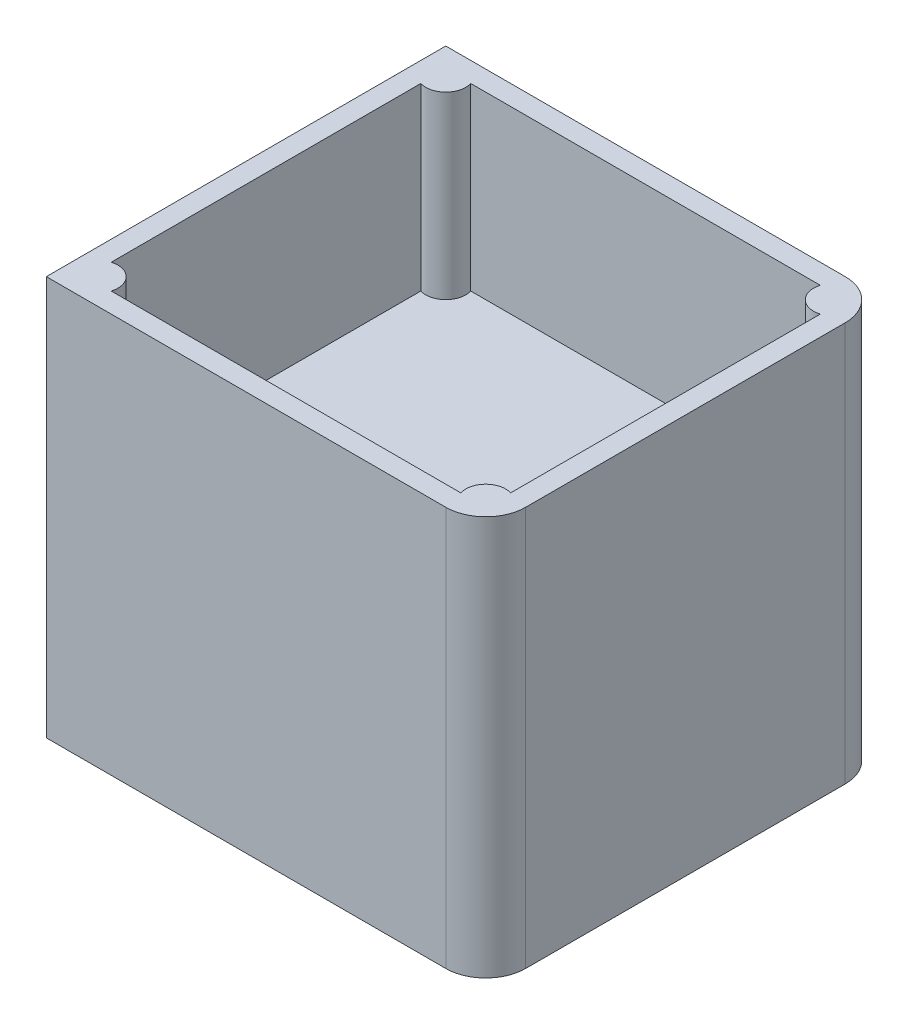
ISO-10303-21;
HEADER;
FILE_DESCRIPTION(('STEP AP214'),'2;1');
FILE_NAME('part.step','',(''),(''),'','','');
FILE_SCHEMA(('AUTOMOTIVE_DESIGN { 1 0 10303 214 1 1 1 1 }'));
ENDSEC;
DATA;
#1=APPLICATION_CONTEXT('core data for automotive mechanical design processes');
#2=APPLICATION_PROTOCOL_DEFINITION('international standard','automotive_design',2000,#1);
#3=PRODUCT_CONTEXT('',#1,'mechanical');
#4=PRODUCT('Part','Part','',(#3));
#5=PRODUCT_RELATED_PRODUCT_CATEGORY('part','',(#4));
#6=PRODUCT_DEFINITION_FORMATION('','',#4);
#7=PRODUCT_DEFINITION_CONTEXT('part definition',#1,'design');
#8=PRODUCT_DEFINITION('design','',#6,#7);
#9=PRODUCT_DEFINITION_SHAPE('','',#8);
#10=(LENGTH_UNIT() NAMED_UNIT(*) SI_UNIT(.MILLI.,.METRE.));
#11=(NAMED_UNIT(*) PLANE_ANGLE_UNIT() SI_UNIT($,.RADIAN.));
#12=(NAMED_UNIT(*) SI_UNIT($,.STERADIAN.) SOLID_ANGLE_UNIT());
#13=UNCERTAINTY_MEASURE_WITH_UNIT(LENGTH_MEASURE(1.E-05),#10,'distance_accuracy_value','');
#14=(GEOMETRIC_REPRESENTATION_CONTEXT(3) GLOBAL_UNCERTAINTY_ASSIGNED_CONTEXT((#13)) GLOBAL_UNIT_ASSIGNED_CONTEXT((#10,
#11,#12)) REPRESENTATION_CONTEXT('',''));
#15=CARTESIAN_POINT('',(0.,0.,0.));
#16=DIRECTION('',(0.,0.,1.));
#17=DIRECTION('',(1.,0.,0.));
#18=AXIS2_PLACEMENT_3D('',#15,#16,#17);
#19=CARTESIAN_POINT('',(-55.,100.,50.));
#20=DIRECTION('',(1.,0.,0.));
#21=DIRECTION('',(0.,0.,-1.));
#22=AXIS2_PLACEMENT_3D('',#19,#20,#21);
#23=PLANE('',#22);
#24=DIRECTION('',(0.,0.,1.));
#25=VECTOR('',#24,1.);
#26=CARTESIAN_POINT('',(-55.,0.,50.));
#27=LINE('',#26,#25);
#28=CARTESIAN_POINT('',(-55.,0.,-50.));
#29=VERTEX_POINT('',#28);
#30=CARTESIAN_POINT('',(-55.,0.,-3.75));
#31=VERTEX_POINT('',#30);
#32=EDGE_CURVE('E223',#29,#31,#27,.T.);
#33=ORIENTED_EDGE('',*,*,#32,.T.);
#34=DIRECTION('',(0.,-1.,0.));
#35=VECTOR('',#34,1.);
#36=CARTESIAN_POINT('',(-55.,0.,-3.75));
#37=LINE('',#36,#35);
#38=CARTESIAN_POINT('',(-55.,5.,-3.75));
#39=VERTEX_POINT('',#38);
#40=EDGE_CURVE('E204',#39,#31,#37,.T.);
#41=ORIENTED_EDGE('',*,*,#40,.F.);
#42=DIRECTION('',(0.,0.,-1.));
#43=VECTOR('',#42,1.);
#44=CARTESIAN_POINT('',(-55.,5.,-3.75));
#45=LINE('',#44,#43);
#46=CARTESIAN_POINT('',(-55.,5.,3.75));
#47=VERTEX_POINT('',#46);
#48=EDGE_CURVE('E228',#47,#39,#45,.T.);
#49=ORIENTED_EDGE('',*,*,#48,.F.);
#50=DIRECTION('',(0.,1.,0.));
#51=VECTOR('',#50,1.);
#52=CARTESIAN_POINT('',(-55.,0.,3.75));
#53=LINE('',#52,#51);
#54=CARTESIAN_POINT('',(-55.,0.,3.75));
#55=VERTEX_POINT('',#54);
#56=EDGE_CURVE('E216',#55,#47,#53,.T.);
#57=ORIENTED_EDGE('',*,*,#56,.F.);
#58=CARTESIAN_POINT('',(-55.,0.,50.));
#59=VERTEX_POINT('',#58);
#60=EDGE_CURVE('E236',#55,#59,#27,.T.);
#61=ORIENTED_EDGE('',*,*,#60,.T.);
#62=DIRECTION('',(0.,-1.,0.));
#63=VECTOR('',#62,1.);
#64=CARTESIAN_POINT('',(-55.,100.,50.));
#65=LINE('',#64,#63);
#66=CARTESIAN_POINT('',(-55.,100.,50.));
#67=VERTEX_POINT('',#66);
#68=EDGE_CURVE('E277',#67,#59,#65,.T.);
#69=ORIENTED_EDGE('',*,*,#68,.F.);
#70=DIRECTION('',(0.,0.,1.));
#71=VECTOR('',#70,1.);
#72=CARTESIAN_POINT('',(-55.,100.,50.));
#73=LINE('',#72,#71);
#74=CARTESIAN_POINT('',(-55.,100.,-50.));
#75=VERTEX_POINT('',#74);
#76=EDGE_CURVE('E258',#75,#67,#73,.T.);
#77=ORIENTED_EDGE('',*,*,#76,.F.);
#78=DIRECTION('',(0.,-1.,0.));
#79=VECTOR('',#78,1.);
#80=CARTESIAN_POINT('',(-55.,100.,-50.));
#81=LINE('',#80,#79);
#82=EDGE_CURVE('E233',#75,#29,#81,.T.);
#83=ORIENTED_EDGE('',*,*,#82,.T.);
#84=EDGE_LOOP('',(#33,#41,#49,#57,#61,#69,#77,#83));
#85=FACE_BOUND('',#84,.T.);
#86=ADVANCED_FACE('F45',(#85),#23,.F.);
#87=CARTESIAN_POINT('',(-55.,100.,50.));
#88=DIRECTION('',(0.,0.,-1.));
#89=DIRECTION('',(-1.,0.,0.));
#90=AXIS2_PLACEMENT_3D('',#87,#88,#89);
#91=PLANE('',#90);
#92=DIRECTION('',(1.,0.,0.));
#93=VECTOR('',#92,1.);
#94=CARTESIAN_POINT('',(-55.,0.,50.));
#95=LINE('',#94,#93);
#96=CARTESIAN_POINT('',(45.,0.,50.));
#97=VERTEX_POINT('',#96);
#98=EDGE_CURVE('E235',#59,#97,#95,.T.);
#99=ORIENTED_EDGE('',*,*,#98,.T.);
#100=DIRECTION('',(0.,-1.,0.));
#101=VECTOR('',#100,1.);
#102=CARTESIAN_POINT('',(45.,100.,50.));
#103=LINE('',#102,#101);
#104=CARTESIAN_POINT('',(45.,100.,50.));
#105=VERTEX_POINT('',#104);
#106=EDGE_CURVE('E273',#105,#97,#103,.T.);
#107=ORIENTED_EDGE('',*,*,#106,.F.);
#108=DIRECTION('',(1.,0.,0.));
#109=VECTOR('',#108,1.);
#110=CARTESIAN_POINT('',(-55.,100.,50.));
#111=LINE('',#110,#109);
#112=EDGE_CURVE('E408',#67,#105,#111,.T.);
#113=ORIENTED_EDGE('',*,*,#112,.F.);
#114=ORIENTED_EDGE('',*,*,#68,.T.);
#115=EDGE_LOOP('',(#99,#107,#113,#114));
#116=FACE_BOUND('',#115,.T.);
#117=ADVANCED_FACE('F429',(#116),#91,.F.);
#118=CARTESIAN_POINT('',(45.,100.,40.));
#119=DIRECTION('',(0.,-1.,0.));
#120=DIRECTION('',(0.,0.,-1.));
#121=AXIS2_PLACEMENT_3D('',#118,#119,#120);
#122=CYLINDRICAL_SURFACE('',#121,10.);
#123=DIRECTION('',(0.,-1.,0.));
#124=VECTOR('',#123,1.);
#125=CARTESIAN_POINT('',(55.,100.,40.));
#126=LINE('',#125,#124);
#127=CARTESIAN_POINT('',(55.,100.,40.));
#128=VERTEX_POINT('',#127);
#129=CARTESIAN_POINT('',(55.,0.,40.));
#130=VERTEX_POINT('',#129);
#131=EDGE_CURVE('E269',#128,#130,#126,.T.);
#132=ORIENTED_EDGE('',*,*,#131,.F.);
#133=CARTESIAN_POINT('',(45.,100.,40.));
#134=DIRECTION('',(0.,1.,0.));
#135=DIRECTION('',(0.,0.,1.));
#136=AXIS2_PLACEMENT_3D('',#133,#134,#135);
#137=CIRCLE('',#136,10.);
#138=EDGE_CURVE('E411',#105,#128,#137,.T.);
#139=ORIENTED_EDGE('',*,*,#138,.F.);
#140=ORIENTED_EDGE('',*,*,#106,.T.);
#141=CARTESIAN_POINT('',(45.,0.,40.));
#142=DIRECTION('',(0.,1.,0.));
#143=DIRECTION('',(0.,0.,1.));
#144=AXIS2_PLACEMENT_3D('',#141,#142,#143);
#145=CIRCLE('',#144,10.);
#146=EDGE_CURVE('E240',#97,#130,#145,.T.);
#147=ORIENTED_EDGE('',*,*,#146,.T.);
#148=EDGE_LOOP('',(#132,#139,#140,#147));
#149=FACE_BOUND('',#148,.T.);
#150=ADVANCED_FACE('F436',(#149),#122,.T.);
#151=CARTESIAN_POINT('',(55.,100.,40.));
#152=DIRECTION('',(-1.,0.,0.));
#153=DIRECTION('',(0.,0.,1.));
#154=AXIS2_PLACEMENT_3D('',#151,#152,#153);
#155=PLANE('',#154);
#156=DIRECTION('',(0.,0.,-1.));
#157=VECTOR('',#156,1.);
#158=CARTESIAN_POINT('',(55.,0.,40.));
#159=LINE('',#158,#157);
#160=CARTESIAN_POINT('',(55.,0.,-40.));
#161=VERTEX_POINT('',#160);
#162=EDGE_CURVE('E249',#130,#161,#159,.T.);
#163=ORIENTED_EDGE('',*,*,#162,.T.);
#164=DIRECTION('',(0.,-1.,0.));
#165=VECTOR('',#164,1.);
#166=CARTESIAN_POINT('',(55.,100.,-40.));
#167=LINE('',#166,#165);
#168=CARTESIAN_POINT('',(55.,100.,-40.));
#169=VERTEX_POINT('',#168);
#170=EDGE_CURVE('E265',#169,#161,#167,.T.);
#171=ORIENTED_EDGE('',*,*,#170,.F.);
#172=DIRECTION('',(0.,0.,-1.));
#173=VECTOR('',#172,1.);
#174=CARTESIAN_POINT('',(55.,100.,40.));
#175=LINE('',#174,#173);
#176=EDGE_CURVE('E414',#128,#169,#175,.T.);
#177=ORIENTED_EDGE('',*,*,#176,.F.);
#178=ORIENTED_EDGE('',*,*,#131,.T.);
#179=EDGE_LOOP('',(#163,#171,#177,#178));
#180=FACE_BOUND('',#179,.T.);
#181=ADVANCED_FACE('F440',(#180),#155,.F.);
#182=CARTESIAN_POINT('',(45.,100.,-40.));
#183=DIRECTION('',(0.,-1.,0.));
#184=DIRECTION('',(0.,0.,-1.));
#185=AXIS2_PLACEMENT_3D('',#182,#183,#184);
#186=CYLINDRICAL_SURFACE('',#185,10.);
#187=DIRECTION('',(0.,-1.,0.));
#188=VECTOR('',#187,1.);
#189=CARTESIAN_POINT('',(45.,100.,-50.));
#190=LINE('',#189,#188);
#191=CARTESIAN_POINT('',(45.,100.,-50.));
#192=VERTEX_POINT('',#191);
#193=CARTESIAN_POINT('',(45.,0.,-50.));
#194=VERTEX_POINT('',#193);
#195=EDGE_CURVE('E261',#192,#194,#190,.T.);
#196=ORIENTED_EDGE('',*,*,#195,.F.);
#197=CARTESIAN_POINT('',(45.,100.,-40.));
#198=DIRECTION('',(0.,1.,0.));
#199=DIRECTION('',(0.,0.,-1.));
#200=AXIS2_PLACEMENT_3D('',#197,#198,#199);
#201=CIRCLE('',#200,10.);
#202=EDGE_CURVE('E416',#169,#192,#201,.T.);
#203=ORIENTED_EDGE('',*,*,#202,.F.);
#204=ORIENTED_EDGE('',*,*,#170,.T.);
#205=CARTESIAN_POINT('',(45.,0.,-40.));
#206=DIRECTION('',(0.,1.,0.));
#207=DIRECTION('',(0.,0.,-1.));
#208=AXIS2_PLACEMENT_3D('',#205,#206,#207);
#209=CIRCLE('',#208,10.);
#210=EDGE_CURVE('E252',#161,#194,#209,.T.);
#211=ORIENTED_EDGE('',*,*,#210,.T.);
#212=EDGE_LOOP('',(#196,#203,#204,#211));
#213=FACE_BOUND('',#212,.T.);
#214=ADVANCED_FACE('F443',(#213),#186,.T.);
#215=CARTESIAN_POINT('',(-55.,100.,-50.));
#216=DIRECTION('',(0.,0.,1.));
#217=DIRECTION('',(1.,0.,0.));
#218=AXIS2_PLACEMENT_3D('',#215,#216,#217);
#219=PLANE('',#218);
#220=DIRECTION('',(-1.,0.,0.));
#221=VECTOR('',#220,1.);
#222=CARTESIAN_POINT('',(-55.,0.,-50.));
#223=LINE('',#222,#221);
#224=EDGE_CURVE('E255',#194,#29,#223,.T.);
#225=ORIENTED_EDGE('',*,*,#224,.T.);
#226=ORIENTED_EDGE('',*,*,#82,.F.);
#227=DIRECTION('',(-1.,0.,0.));
#228=VECTOR('',#227,1.);
#229=CARTESIAN_POINT('',(-55.,100.,-50.));
#230=LINE('',#229,#228);
#231=EDGE_CURVE('E244',#192,#75,#230,.T.);
#232=ORIENTED_EDGE('',*,*,#231,.F.);
#233=ORIENTED_EDGE('',*,*,#195,.T.);
#234=EDGE_LOOP('',(#225,#226,#232,#233));
#235=FACE_BOUND('',#234,.T.);
#236=ADVANCED_FACE('F424',(#235),#219,.F.);
#237=CARTESIAN_POINT('',(45.,100.,-40.));
#238=DIRECTION('',(0.,-1.,0.));
#239=DIRECTION('',(0.,0.,-1.));
#240=AXIS2_PLACEMENT_3D('',#237,#238,#239);
#241=PLANE('',#240);
#242=DIRECTION('',(0.,0.,1.));
#243=VECTOR('',#242,1.);
#244=CARTESIAN_POINT('',(-50.,100.,-45.));
#245=LINE('',#244,#243);
#246=CARTESIAN_POINT('',(-50.,100.,-38.7548081180081));
#247=VERTEX_POINT('',#246);
#248=CARTESIAN_POINT('',(-50.,100.,38.7548081180081));
#249=VERTEX_POINT('',#248);
#250=EDGE_CURVE('E312',#247,#249,#245,.T.);
#251=ORIENTED_EDGE('',*,*,#250,.F.);
#252=CARTESIAN_POINT('',(-48.5355339059327,100.,-43.5355339059327));
#253=DIRECTION('',(0.,1.,0.));
#254=DIRECTION('',(0.,0.,1.));
#255=AXIS2_PLACEMENT_3D('',#252,#253,#254);
#256=CIRCLE('',#255,5.);
#257=CARTESIAN_POINT('',(-43.7548081180081,100.,-45.));
#258=VERTEX_POINT('',#257);
#259=EDGE_CURVE('E480',#247,#258,#256,.T.);
#260=ORIENTED_EDGE('',*,*,#259,.T.);
#261=DIRECTION('',(-1.,0.,0.));
#262=VECTOR('',#261,1.);
#263=CARTESIAN_POINT('',(45.,100.,-45.));
#264=LINE('',#263,#262);
#265=CARTESIAN_POINT('',(43.7548081180082,100.,-45.));
#266=VERTEX_POINT('',#265);
#267=EDGE_CURVE('E319',#266,#258,#264,.T.);
#268=ORIENTED_EDGE('',*,*,#267,.F.);
#269=CARTESIAN_POINT('',(48.5355339059328,100.,-43.5355339059327));
#270=DIRECTION('',(0.,1.,0.));
#271=DIRECTION('',(0.,0.,1.));
#272=AXIS2_PLACEMENT_3D('',#269,#270,#271);
#273=CIRCLE('',#272,5.);
#274=CARTESIAN_POINT('',(50.,100.,-38.7548081180081));
#275=VERTEX_POINT('',#274);
#276=EDGE_CURVE('E512',#266,#275,#273,.T.);
#277=ORIENTED_EDGE('',*,*,#276,.T.);
#278=DIRECTION('',(0.,0.,-1.));
#279=VECTOR('',#278,1.);
#280=CARTESIAN_POINT('',(50.,100.,40.));
#281=LINE('',#280,#279);
#282=CARTESIAN_POINT('',(50.,100.,38.7548081180081));
#283=VERTEX_POINT('',#282);
#284=EDGE_CURVE('E311',#283,#275,#281,.T.);
#285=ORIENTED_EDGE('',*,*,#284,.F.);
#286=CARTESIAN_POINT('',(48.5355339059328,100.,43.5355339059327));
#287=DIRECTION('',(0.,1.,0.));
#288=DIRECTION('',(0.,0.,1.));
#289=AXIS2_PLACEMENT_3D('',#286,#287,#288);
#290=CIRCLE('',#289,5.);
#291=CARTESIAN_POINT('',(43.7548081180082,100.,45.));
#292=VERTEX_POINT('',#291);
#293=EDGE_CURVE('E309',#283,#292,#290,.T.);
#294=ORIENTED_EDGE('',*,*,#293,.T.);
#295=DIRECTION('',(1.,0.,0.));
#296=VECTOR('',#295,1.);
#297=CARTESIAN_POINT('',(-50.,100.,45.));
#298=LINE('',#297,#296);
#299=CARTESIAN_POINT('',(-43.7548081180081,100.,45.));
#300=VERTEX_POINT('',#299);
#301=EDGE_CURVE('E295',#300,#292,#298,.T.);
#302=ORIENTED_EDGE('',*,*,#301,.F.);
#303=CARTESIAN_POINT('',(-48.5355339059327,100.,43.5355339059327));
#304=DIRECTION('',(0.,1.,0.));
#305=DIRECTION('',(0.,0.,1.));
#306=AXIS2_PLACEMENT_3D('',#303,#304,#305);
#307=CIRCLE('',#306,5.);
#308=EDGE_CURVE('E307',#300,#249,#307,.T.);
#309=ORIENTED_EDGE('',*,*,#308,.T.);
#310=EDGE_LOOP('',(#251,#260,#268,#277,#285,#294,#302,#309));
#311=FACE_BOUND('',#310,.T.);
#312=ORIENTED_EDGE('',*,*,#202,.T.);
#313=ORIENTED_EDGE('',*,*,#231,.T.);
#314=ORIENTED_EDGE('',*,*,#76,.T.);
#315=ORIENTED_EDGE('',*,*,#112,.T.);
#316=ORIENTED_EDGE('',*,*,#138,.T.);
#317=ORIENTED_EDGE('',*,*,#176,.T.);
#318=EDGE_LOOP('',(#312,#313,#314,#315,#316,#317));
#319=FACE_BOUND('',#318,.T.);
#320=ADVANCED_FACE('F305',(#311,#319),#241,.F.);
#321=CARTESIAN_POINT('',(45.,0.,-40.));
#322=DIRECTION('',(0.,-1.,0.));
#323=DIRECTION('',(0.,0.,-1.));
#324=AXIS2_PLACEMENT_3D('',#321,#322,#323);
#325=PLANE('',#324);
#326=DIRECTION('',(-1.,0.,0.));
#327=VECTOR('',#326,1.);
#328=CARTESIAN_POINT('',(-40.98612181134,0.,-3.75));
#329=LINE('',#328,#327);
#330=CARTESIAN_POINT('',(-50.,0.,-3.75));
#331=VERTEX_POINT('',#330);
#332=EDGE_CURVE('E207',#331,#31,#329,.T.);
#333=ORIENTED_EDGE('',*,*,#332,.T.);
#334=ORIENTED_EDGE('',*,*,#32,.F.);
#335=ORIENTED_EDGE('',*,*,#224,.F.);
#336=ORIENTED_EDGE('',*,*,#210,.F.);
#337=ORIENTED_EDGE('',*,*,#162,.F.);
#338=ORIENTED_EDGE('',*,*,#146,.F.);
#339=ORIENTED_EDGE('',*,*,#98,.F.);
#340=ORIENTED_EDGE('',*,*,#60,.F.);
#341=DIRECTION('',(-1.,0.,0.));
#342=VECTOR('',#341,1.);
#343=CARTESIAN_POINT('',(-40.98612181134,0.,3.75));
#344=LINE('',#343,#342);
#345=CARTESIAN_POINT('',(-50.,0.,3.75));
#346=VERTEX_POINT('',#345);
#347=EDGE_CURVE('E227',#346,#55,#344,.T.);
#348=ORIENTED_EDGE('',*,*,#347,.F.);
#349=DIRECTION('',(0.,0.,-1.));
#350=VECTOR('',#349,1.);
#351=CARTESIAN_POINT('',(-50.,0.,45.));
#352=LINE('',#351,#350);
#353=CARTESIAN_POINT('',(-50.,0.,45.));
#354=VERTEX_POINT('',#353);
#355=EDGE_CURVE('E368',#354,#346,#352,.T.);
#356=ORIENTED_EDGE('',*,*,#355,.F.);
#357=DIRECTION('',(-1.,0.,0.));
#358=VECTOR('',#357,1.);
#359=CARTESIAN_POINT('',(45.,0.,45.));
#360=LINE('',#359,#358);
#361=CARTESIAN_POINT('',(45.,0.,45.));
#362=VERTEX_POINT('',#361);
#363=EDGE_CURVE('E333',#362,#354,#360,.T.);
#364=ORIENTED_EDGE('',*,*,#363,.F.);
#365=CARTESIAN_POINT('',(45.,0.,40.));
#366=DIRECTION('',(0.,-1.,0.));
#367=DIRECTION('',(0.,0.,-1.));
#368=AXIS2_PLACEMENT_3D('',#365,#366,#367);
#369=CIRCLE('',#368,5.);
#370=CARTESIAN_POINT('',(50.,0.,40.));
#371=VERTEX_POINT('',#370);
#372=EDGE_CURVE('E345',#371,#362,#369,.T.);
#373=ORIENTED_EDGE('',*,*,#372,.F.);
#374=DIRECTION('',(0.,0.,1.));
#375=VECTOR('',#374,1.);
#376=CARTESIAN_POINT('',(50.,0.,-40.));
#377=LINE('',#376,#375);
#378=CARTESIAN_POINT('',(50.,0.,-40.));
#379=VERTEX_POINT('',#378);
#380=EDGE_CURVE('E380',#379,#371,#377,.T.);
#381=ORIENTED_EDGE('',*,*,#380,.F.);
#382=CARTESIAN_POINT('',(45.,0.,-40.));
#383=DIRECTION('',(0.,-1.,0.));
#384=DIRECTION('',(0.,0.,-1.));
#385=AXIS2_PLACEMENT_3D('',#382,#383,#384);
#386=CIRCLE('',#385,5.);
#387=CARTESIAN_POINT('',(45.,0.,-45.));
#388=VERTEX_POINT('',#387);
#389=EDGE_CURVE('E376',#388,#379,#386,.T.);
#390=ORIENTED_EDGE('',*,*,#389,.F.);
#391=DIRECTION('',(1.,0.,0.));
#392=VECTOR('',#391,1.);
#393=CARTESIAN_POINT('',(-50.,0.,-45.));
#394=LINE('',#393,#392);
#395=CARTESIAN_POINT('',(-50.,0.,-45.));
#396=VERTEX_POINT('',#395);
#397=EDGE_CURVE('E372',#396,#388,#394,.T.);
#398=ORIENTED_EDGE('',*,*,#397,.F.);
#399=EDGE_CURVE('E225',#331,#396,#352,.T.);
#400=ORIENTED_EDGE('',*,*,#399,.F.);
#401=EDGE_LOOP('',(#333,#334,#335,#336,#337,#338,#339,#340,#348,#356,#364,#373,#381,#390,#398,#400));
#402=FACE_BOUND('',#401,.T.);
#403=ADVANCED_FACE('F221',(#402),#325,.T.);
#404=CARTESIAN_POINT('',(45.,50.,45.));
#405=DIRECTION('',(0.,0.,1.));
#406=DIRECTION('',(1.,0.,0.));
#407=AXIS2_PLACEMENT_3D('',#404,#405,#406);
#408=PLANE('',#407);
#409=ORIENTED_EDGE('',*,*,#363,.T.);
#410=DIRECTION('',(0.,-1.,0.));
#411=VECTOR('',#410,1.);
#412=CARTESIAN_POINT('',(-50.,50.,45.));
#413=LINE('',#412,#411);
#414=CARTESIAN_POINT('',(-50.,50.,45.));
#415=VERTEX_POINT('',#414);
#416=EDGE_CURVE('E365',#415,#354,#413,.T.);
#417=ORIENTED_EDGE('',*,*,#416,.F.);
#418=DIRECTION('',(-1.,0.,0.));
#419=VECTOR('',#418,1.);
#420=CARTESIAN_POINT('',(45.,50.,45.));
#421=LINE('',#420,#419);
#422=CARTESIAN_POINT('',(45.,50.,45.));
#423=VERTEX_POINT('',#422);
#424=EDGE_CURVE('E340',#423,#415,#421,.T.);
#425=ORIENTED_EDGE('',*,*,#424,.F.);
#426=DIRECTION('',(0.,-1.,0.));
#427=VECTOR('',#426,1.);
#428=CARTESIAN_POINT('',(45.,50.,45.));
#429=LINE('',#428,#427);
#430=EDGE_CURVE('E242',#423,#362,#429,.T.);
#431=ORIENTED_EDGE('',*,*,#430,.T.);
#432=EDGE_LOOP('',(#409,#417,#425,#431));
#433=FACE_BOUND('',#432,.T.);
#434=ADVANCED_FACE('F457',(#433),#408,.F.);
#435=CARTESIAN_POINT('',(45.,50.,40.));
#436=DIRECTION('',(0.,-1.,0.));
#437=DIRECTION('',(0.,0.,-1.));
#438=AXIS2_PLACEMENT_3D('',#435,#436,#437);
#439=CYLINDRICAL_SURFACE('',#438,5.);
#440=ORIENTED_EDGE('',*,*,#372,.T.);
#441=ORIENTED_EDGE('',*,*,#430,.F.);
#442=CARTESIAN_POINT('',(45.,50.,40.));
#443=DIRECTION('',(0.,-1.,0.));
#444=DIRECTION('',(0.,0.,-1.));
#445=AXIS2_PLACEMENT_3D('',#442,#443,#444);
#446=CIRCLE('',#445,5.);
#447=CARTESIAN_POINT('',(50.,50.,40.));
#448=VERTEX_POINT('',#447);
#449=EDGE_CURVE('E361',#448,#423,#446,.T.);
#450=ORIENTED_EDGE('',*,*,#449,.F.);
#451=DIRECTION('',(0.,-1.,0.));
#452=VECTOR('',#451,1.);
#453=CARTESIAN_POINT('',(50.,50.,40.));
#454=LINE('',#453,#452);
#455=EDGE_CURVE('E389',#448,#371,#454,.T.);
#456=ORIENTED_EDGE('',*,*,#455,.T.);
#457=EDGE_LOOP('',(#440,#441,#450,#456));
#458=FACE_BOUND('',#457,.T.);
#459=ADVANCED_FACE('F462',(#458),#439,.F.);
#460=CARTESIAN_POINT('',(50.,50.,-40.));
#461=DIRECTION('',(1.,0.,0.));
#462=DIRECTION('',(0.,0.,-1.));
#463=AXIS2_PLACEMENT_3D('',#460,#461,#462);
#464=PLANE('',#463);
#465=ORIENTED_EDGE('',*,*,#380,.T.);
#466=ORIENTED_EDGE('',*,*,#455,.F.);
#467=DIRECTION('',(0.,0.,1.));
#468=VECTOR('',#467,1.);
#469=CARTESIAN_POINT('',(50.,50.,-40.));
#470=LINE('',#469,#468);
#471=CARTESIAN_POINT('',(50.,50.,-40.));
#472=VERTEX_POINT('',#471);
#473=EDGE_CURVE('E357',#472,#448,#470,.T.);
#474=ORIENTED_EDGE('',*,*,#473,.F.);
#475=DIRECTION('',(0.,-1.,0.));
#476=VECTOR('',#475,1.);
#477=CARTESIAN_POINT('',(50.,50.,-40.));
#478=LINE('',#477,#476);
#479=EDGE_CURVE('E392',#472,#379,#478,.T.);
#480=ORIENTED_EDGE('',*,*,#479,.T.);
#481=EDGE_LOOP('',(#465,#466,#474,#480));
#482=FACE_BOUND('',#481,.T.);
#483=ADVANCED_FACE('F466',(#482),#464,.F.);
#484=CARTESIAN_POINT('',(45.,50.,-40.));
#485=DIRECTION('',(0.,-1.,0.));
#486=DIRECTION('',(0.,0.,-1.));
#487=AXIS2_PLACEMENT_3D('',#484,#485,#486);
#488=CYLINDRICAL_SURFACE('',#487,5.);
#489=ORIENTED_EDGE('',*,*,#389,.T.);
#490=ORIENTED_EDGE('',*,*,#479,.F.);
#491=CARTESIAN_POINT('',(45.,50.,-40.));
#492=DIRECTION('',(0.,-1.,0.));
#493=DIRECTION('',(0.,0.,-1.));
#494=AXIS2_PLACEMENT_3D('',#491,#492,#493);
#495=CIRCLE('',#494,5.);
#496=CARTESIAN_POINT('',(45.,50.,-45.));
#497=VERTEX_POINT('',#496);
#498=EDGE_CURVE('E353',#497,#472,#495,.T.);
#499=ORIENTED_EDGE('',*,*,#498,.F.);
#500=DIRECTION('',(0.,-1.,0.));
#501=VECTOR('',#500,1.);
#502=CARTESIAN_POINT('',(45.,50.,-45.));
#503=LINE('',#502,#501);
#504=EDGE_CURVE('E395',#497,#388,#503,.T.);
#505=ORIENTED_EDGE('',*,*,#504,.T.);
#506=EDGE_LOOP('',(#489,#490,#499,#505));
#507=FACE_BOUND('',#506,.T.);
#508=ADVANCED_FACE('F469',(#507),#488,.F.);
#509=CARTESIAN_POINT('',(-50.,50.,-45.));
#510=DIRECTION('',(0.,0.,-1.));
#511=DIRECTION('',(-1.,0.,0.));
#512=AXIS2_PLACEMENT_3D('',#509,#510,#511);
#513=PLANE('',#512);
#514=ORIENTED_EDGE('',*,*,#397,.T.);
#515=ORIENTED_EDGE('',*,*,#504,.F.);
#516=DIRECTION('',(1.,0.,0.));
#517=VECTOR('',#516,1.);
#518=CARTESIAN_POINT('',(-50.,50.,-45.));
#519=LINE('',#518,#517);
#520=CARTESIAN_POINT('',(-50.,50.,-45.));
#521=VERTEX_POINT('',#520);
#522=EDGE_CURVE('E349',#521,#497,#519,.T.);
#523=ORIENTED_EDGE('',*,*,#522,.F.);
#524=DIRECTION('',(0.,-1.,0.));
#525=VECTOR('',#524,1.);
#526=CARTESIAN_POINT('',(-50.,50.,-45.));
#527=LINE('',#526,#525);
#528=EDGE_CURVE('E398',#521,#396,#527,.T.);
#529=ORIENTED_EDGE('',*,*,#528,.T.);
#530=EDGE_LOOP('',(#514,#515,#523,#529));
#531=FACE_BOUND('',#530,.T.);
#532=ADVANCED_FACE('F471',(#531),#513,.F.);
#533=CARTESIAN_POINT('',(-50.,50.,45.));
#534=DIRECTION('',(-1.,0.,0.));
#535=DIRECTION('',(0.,0.,1.));
#536=AXIS2_PLACEMENT_3D('',#533,#534,#535);
#537=PLANE('',#536);
#538=DIRECTION('',(0.,0.,1.));
#539=VECTOR('',#538,1.);
#540=CARTESIAN_POINT('',(-50.,5.,-3.75));
#541=LINE('',#540,#539);
#542=CARTESIAN_POINT('',(-50.,5.,-3.75));
#543=VERTEX_POINT('',#542);
#544=CARTESIAN_POINT('',(-50.,5.,3.75));
#545=VERTEX_POINT('',#544);
#546=EDGE_CURVE('E475',#543,#545,#541,.T.);
#547=ORIENTED_EDGE('',*,*,#546,.F.);
#548=DIRECTION('',(0.,1.,0.));
#549=VECTOR('',#548,1.);
#550=CARTESIAN_POINT('',(-50.,0.,-3.75));
#551=LINE('',#550,#549);
#552=EDGE_CURVE('E473',#331,#543,#551,.T.);
#553=ORIENTED_EDGE('',*,*,#552,.F.);
#554=ORIENTED_EDGE('',*,*,#399,.T.);
#555=ORIENTED_EDGE('',*,*,#528,.F.);
#556=DIRECTION('',(0.,0.,-1.));
#557=VECTOR('',#556,1.);
#558=CARTESIAN_POINT('',(-50.,50.,45.));
#559=LINE('',#558,#557);
#560=EDGE_CURVE('E344',#415,#521,#559,.T.);
#561=ORIENTED_EDGE('',*,*,#560,.F.);
#562=ORIENTED_EDGE('',*,*,#416,.T.);
#563=ORIENTED_EDGE('',*,*,#355,.T.);
#564=DIRECTION('',(0.,-1.,0.));
#565=VECTOR('',#564,1.);
#566=CARTESIAN_POINT('',(-50.,0.,3.75));
#567=LINE('',#566,#565);
#568=EDGE_CURVE('E453',#545,#346,#567,.T.);
#569=ORIENTED_EDGE('',*,*,#568,.F.);
#570=EDGE_LOOP('',(#547,#553,#554,#555,#561,#562,#563,#569));
#571=FACE_BOUND('',#570,.T.);
#572=ADVANCED_FACE('F452',(#571),#537,.F.);
#573=CARTESIAN_POINT('',(45.,50.,-40.));
#574=DIRECTION('',(0.,-1.,0.));
#575=DIRECTION('',(0.,0.,-1.));
#576=AXIS2_PLACEMENT_3D('',#573,#574,#575);
#577=PLANE('',#576);
#578=ORIENTED_EDGE('',*,*,#424,.T.);
#579=ORIENTED_EDGE('',*,*,#560,.T.);
#580=ORIENTED_EDGE('',*,*,#522,.T.);
#581=ORIENTED_EDGE('',*,*,#498,.T.);
#582=ORIENTED_EDGE('',*,*,#473,.T.);
#583=ORIENTED_EDGE('',*,*,#449,.T.);
#584=EDGE_LOOP('',(#578,#579,#580,#581,#582,#583));
#585=FACE_BOUND('',#584,.T.);
#586=ADVANCED_FACE('F578',(#585),#577,.T.);
#587=CARTESIAN_POINT('',(45.,55.,-40.));
#588=DIRECTION('',(0.,-1.,0.));
#589=DIRECTION('',(0.,0.,-1.));
#590=AXIS2_PLACEMENT_3D('',#587,#588,#589);
#591=PLANE('',#590);
#592=DIRECTION('',(-1.,0.,0.));
#593=VECTOR('',#592,1.);
#594=CARTESIAN_POINT('',(45.,55.,-45.));
#595=LINE('',#594,#593);
#596=CARTESIAN_POINT('',(43.7548081180082,55.,-45.));
#597=VERTEX_POINT('',#596);
#598=CARTESIAN_POINT('',(-43.7548081180081,55.,-45.));
#599=VERTEX_POINT('',#598);
#600=EDGE_CURVE('E329',#597,#599,#595,.T.);
#601=ORIENTED_EDGE('',*,*,#600,.T.);
#602=CARTESIAN_POINT('',(-48.5355339059327,55.,-43.5355339059327));
#603=DIRECTION('',(0.,-1.,0.));
#604=DIRECTION('',(0.,0.,-1.));
#605=AXIS2_PLACEMENT_3D('',#602,#603,#604);
#606=CIRCLE('',#605,5.);
#607=CARTESIAN_POINT('',(-50.,55.,-38.7548081180081));
#608=VERTEX_POINT('',#607);
#609=EDGE_CURVE('E68',#608,#599,#606,.F.);
#610=ORIENTED_EDGE('',*,*,#609,.F.);
#611=DIRECTION('',(0.,0.,1.));
#612=VECTOR('',#611,1.);
#613=CARTESIAN_POINT('',(-50.,55.,-45.));
#614=LINE('',#613,#612);
#615=CARTESIAN_POINT('',(-50.,55.,38.7548081180081));
#616=VERTEX_POINT('',#615);
#617=EDGE_CURVE('E317',#608,#616,#614,.T.);
#618=ORIENTED_EDGE('',*,*,#617,.T.);
#619=CARTESIAN_POINT('',(-48.5355339059327,55.,43.5355339059327));
#620=DIRECTION('',(0.,-1.,0.));
#621=DIRECTION('',(0.,0.,-1.));
#622=AXIS2_PLACEMENT_3D('',#619,#620,#621);
#623=CIRCLE('',#622,5.);
#624=CARTESIAN_POINT('',(-43.7548081180081,55.,45.));
#625=VERTEX_POINT('',#624);
#626=EDGE_CURVE('E500',#625,#616,#623,.F.);
#627=ORIENTED_EDGE('',*,*,#626,.F.);
#628=DIRECTION('',(1.,0.,0.));
#629=VECTOR('',#628,1.);
#630=CARTESIAN_POINT('',(-50.,55.,45.));
#631=LINE('',#630,#629);
#632=CARTESIAN_POINT('',(43.7548081180082,55.,45.));
#633=VERTEX_POINT('',#632);
#634=EDGE_CURVE('E297',#625,#633,#631,.T.);
#635=ORIENTED_EDGE('',*,*,#634,.T.);
#636=CARTESIAN_POINT('',(48.5355339059328,55.,43.5355339059327));
#637=DIRECTION('',(0.,-1.,0.));
#638=DIRECTION('',(0.,0.,-1.));
#639=AXIS2_PLACEMENT_3D('',#636,#637,#638);
#640=CIRCLE('',#639,5.);
#641=CARTESIAN_POINT('',(50.,55.,38.7548081180081));
#642=VERTEX_POINT('',#641);
#643=EDGE_CURVE('E522',#642,#633,#640,.F.);
#644=ORIENTED_EDGE('',*,*,#643,.F.);
#645=DIRECTION('',(0.,0.,-1.));
#646=VECTOR('',#645,1.);
#647=CARTESIAN_POINT('',(50.,55.,40.));
#648=LINE('',#647,#646);
#649=CARTESIAN_POINT('',(50.,55.,-38.7548081180081));
#650=VERTEX_POINT('',#649);
#651=EDGE_CURVE('E334',#642,#650,#648,.T.);
#652=ORIENTED_EDGE('',*,*,#651,.T.);
#653=CARTESIAN_POINT('',(48.5355339059328,55.,-43.5355339059327));
#654=DIRECTION('',(0.,-1.,0.));
#655=DIRECTION('',(0.,0.,-1.));
#656=AXIS2_PLACEMENT_3D('',#653,#654,#655);
#657=CIRCLE('',#656,5.);
#658=EDGE_CURVE('E509',#597,#650,#657,.F.);
#659=ORIENTED_EDGE('',*,*,#658,.F.);
#660=EDGE_LOOP('',(#601,#610,#618,#627,#635,#644,#652,#659));
#661=FACE_BOUND('',#660,.T.);
#662=ADVANCED_FACE('F531',(#661),#591,.F.);
#663=CARTESIAN_POINT('',(-50.,-84.5362404707371,-45.));
#664=DIRECTION('',(-1.,0.,0.));
#665=DIRECTION('',(0.,0.,1.));
#666=AXIS2_PLACEMENT_3D('',#663,#664,#665);
#667=PLANE('',#666);
#668=ORIENTED_EDGE('',*,*,#617,.F.);
#669=DIRECTION('',(0.,1.,0.));
#670=VECTOR('',#669,1.);
#671=CARTESIAN_POINT('',(-50.,40.8578643762691,-38.7548081180081));
#672=LINE('',#671,#670);
#673=EDGE_CURVE('E496',#608,#247,#672,.T.);
#674=ORIENTED_EDGE('',*,*,#673,.T.);
#675=ORIENTED_EDGE('',*,*,#250,.T.);
#676=DIRECTION('',(0.,1.,0.));
#677=VECTOR('',#676,1.);
#678=CARTESIAN_POINT('',(-50.,40.8578643762691,38.7548081180081));
#679=LINE('',#678,#677);
#680=EDGE_CURVE('E505',#249,#616,#679,.F.);
#681=ORIENTED_EDGE('',*,*,#680,.T.);
#682=EDGE_LOOP('',(#668,#674,#675,#681));
#683=FACE_BOUND('',#682,.T.);
#684=ADVANCED_FACE('F543',(#683),#667,.F.);
#685=CARTESIAN_POINT('',(-50.,-84.5362404707371,45.));
#686=DIRECTION('',(0.,0.,1.));
#687=DIRECTION('',(1.,0.,0.));
#688=AXIS2_PLACEMENT_3D('',#685,#686,#687);
#689=PLANE('',#688);
#690=ORIENTED_EDGE('',*,*,#634,.F.);
#691=DIRECTION('',(0.,1.,0.));
#692=VECTOR('',#691,1.);
#693=CARTESIAN_POINT('',(-43.7548081180081,40.8578643762691,45.));
#694=LINE('',#693,#692);
#695=EDGE_CURVE('E53',#625,#300,#694,.T.);
#696=ORIENTED_EDGE('',*,*,#695,.T.);
#697=ORIENTED_EDGE('',*,*,#301,.T.);
#698=DIRECTION('',(0.,1.,0.));
#699=VECTOR('',#698,1.);
#700=CARTESIAN_POINT('',(43.7548081180082,40.8578643762691,45.));
#701=LINE('',#700,#699);
#702=EDGE_CURVE('E326',#292,#633,#701,.F.);
#703=ORIENTED_EDGE('',*,*,#702,.T.);
#704=EDGE_LOOP('',(#690,#696,#697,#703));
#705=FACE_BOUND('',#704,.T.);
#706=ADVANCED_FACE('F293',(#705),#689,.F.);
#707=CARTESIAN_POINT('',(50.,-84.5362404707371,40.));
#708=DIRECTION('',(1.,0.,0.));
#709=DIRECTION('',(0.,0.,-1.));
#710=AXIS2_PLACEMENT_3D('',#707,#708,#709);
#711=PLANE('',#710);
#712=ORIENTED_EDGE('',*,*,#284,.T.);
#713=DIRECTION('',(0.,1.,0.));
#714=VECTOR('',#713,1.);
#715=CARTESIAN_POINT('',(50.,40.8578643762691,-38.7548081180081));
#716=LINE('',#715,#714);
#717=EDGE_CURVE('E516',#275,#650,#716,.F.);
#718=ORIENTED_EDGE('',*,*,#717,.T.);
#719=ORIENTED_EDGE('',*,*,#651,.F.);
#720=DIRECTION('',(0.,1.,0.));
#721=VECTOR('',#720,1.);
#722=CARTESIAN_POINT('',(50.,40.8578643762691,38.7548081180081));
#723=LINE('',#722,#721);
#724=EDGE_CURVE('E281',#642,#283,#723,.T.);
#725=ORIENTED_EDGE('',*,*,#724,.T.);
#726=EDGE_LOOP('',(#712,#718,#719,#725));
#727=FACE_BOUND('',#726,.T.);
#728=ADVANCED_FACE('F534',(#727),#711,.F.);
#729=CARTESIAN_POINT('',(45.,-84.5362404707371,-45.));
#730=DIRECTION('',(0.,0.,-1.));
#731=DIRECTION('',(-1.,0.,0.));
#732=AXIS2_PLACEMENT_3D('',#729,#730,#731);
#733=PLANE('',#732);
#734=ORIENTED_EDGE('',*,*,#267,.T.);
#735=DIRECTION('',(0.,1.,0.));
#736=VECTOR('',#735,1.);
#737=CARTESIAN_POINT('',(-43.7548081180081,40.8578643762691,-45.));
#738=LINE('',#737,#736);
#739=EDGE_CURVE('E12',#258,#599,#738,.F.);
#740=ORIENTED_EDGE('',*,*,#739,.T.);
#741=ORIENTED_EDGE('',*,*,#600,.F.);
#742=DIRECTION('',(0.,1.,0.));
#743=VECTOR('',#742,1.);
#744=CARTESIAN_POINT('',(43.7548081180082,40.8578643762691,-45.));
#745=LINE('',#744,#743);
#746=EDGE_CURVE('E285',#597,#266,#745,.T.);
#747=ORIENTED_EDGE('',*,*,#746,.T.);
#748=EDGE_LOOP('',(#734,#740,#741,#747));
#749=FACE_BOUND('',#748,.T.);
#750=ADVANCED_FACE('F539',(#749),#733,.F.);
#751=CARTESIAN_POINT('',(48.5355339059328,40.8578643762691,43.5355339059327));
#752=DIRECTION('',(0.,1.,0.));
#753=DIRECTION('',(0.,0.,1.));
#754=AXIS2_PLACEMENT_3D('',#751,#752,#753);
#755=CYLINDRICAL_SURFACE('',#754,5.);
#756=ORIENTED_EDGE('',*,*,#702,.F.);
#757=ORIENTED_EDGE('',*,*,#293,.F.);
#758=ORIENTED_EDGE('',*,*,#724,.F.);
#759=ORIENTED_EDGE('',*,*,#643,.T.);
#760=EDGE_LOOP('',(#756,#757,#758,#759));
#761=FACE_BOUND('',#760,.T.);
#762=ADVANCED_FACE('F527',(#761),#755,.T.);
#763=CARTESIAN_POINT('',(48.5355339059328,40.8578643762691,-43.5355339059327));
#764=DIRECTION('',(0.,1.,0.));
#765=DIRECTION('',(0.,0.,1.));
#766=AXIS2_PLACEMENT_3D('',#763,#764,#765);
#767=CYLINDRICAL_SURFACE('',#766,5.);
#768=ORIENTED_EDGE('',*,*,#717,.F.);
#769=ORIENTED_EDGE('',*,*,#276,.F.);
#770=ORIENTED_EDGE('',*,*,#746,.F.);
#771=ORIENTED_EDGE('',*,*,#658,.T.);
#772=EDGE_LOOP('',(#768,#769,#770,#771));
#773=FACE_BOUND('',#772,.T.);
#774=ADVANCED_FACE('F536',(#773),#767,.T.);
#775=CARTESIAN_POINT('',(-48.5355339059327,40.8578643762691,43.5355339059327));
#776=DIRECTION('',(0.,1.,0.));
#777=DIRECTION('',(0.,0.,1.));
#778=AXIS2_PLACEMENT_3D('',#775,#776,#777);
#779=CYLINDRICAL_SURFACE('',#778,5.);
#780=ORIENTED_EDGE('',*,*,#680,.F.);
#781=ORIENTED_EDGE('',*,*,#308,.F.);
#782=ORIENTED_EDGE('',*,*,#695,.F.);
#783=ORIENTED_EDGE('',*,*,#626,.T.);
#784=EDGE_LOOP('',(#780,#781,#782,#783));
#785=FACE_BOUND('',#784,.T.);
#786=ADVANCED_FACE('F545',(#785),#779,.T.);
#787=CARTESIAN_POINT('',(-48.5355339059327,40.8578643762691,-43.5355339059327));
#788=DIRECTION('',(0.,1.,0.));
#789=DIRECTION('',(0.,0.,1.));
#790=AXIS2_PLACEMENT_3D('',#787,#788,#789);
#791=CYLINDRICAL_SURFACE('',#790,5.);
#792=ORIENTED_EDGE('',*,*,#673,.F.);
#793=ORIENTED_EDGE('',*,*,#609,.T.);
#794=ORIENTED_EDGE('',*,*,#739,.F.);
#795=ORIENTED_EDGE('',*,*,#259,.F.);
#796=EDGE_LOOP('',(#792,#793,#794,#795));
#797=FACE_BOUND('',#796,.T.);
#798=ADVANCED_FACE('F547',(#797),#791,.T.);
#799=CARTESIAN_POINT('',(-40.98612181134,0.,-3.75));
#800=DIRECTION('',(0.,0.,-1.));
#801=DIRECTION('',(-1.,0.,0.));
#802=AXIS2_PLACEMENT_3D('',#799,#800,#801);
#803=PLANE('',#802);
#804=ORIENTED_EDGE('',*,*,#552,.T.);
#805=DIRECTION('',(-1.,0.,0.));
#806=VECTOR('',#805,1.);
#807=CARTESIAN_POINT('',(-40.98612181134,5.,-3.75));
#808=LINE('',#807,#806);
#809=EDGE_CURVE('E210',#543,#39,#808,.T.);
#810=ORIENTED_EDGE('',*,*,#809,.T.);
#811=ORIENTED_EDGE('',*,*,#40,.T.);
#812=ORIENTED_EDGE('',*,*,#332,.F.);
#813=EDGE_LOOP('',(#804,#810,#811,#812));
#814=FACE_BOUND('',#813,.T.);
#815=ADVANCED_FACE('F206',(#814),#803,.F.);
#816=CARTESIAN_POINT('',(-40.98612181134,5.,-3.75));
#817=DIRECTION('',(0.,1.,0.));
#818=DIRECTION('',(0.,0.,1.));
#819=AXIS2_PLACEMENT_3D('',#816,#817,#818);
#820=PLANE('',#819);
#821=ORIENTED_EDGE('',*,*,#546,.T.);
#822=DIRECTION('',(-1.,0.,0.));
#823=VECTOR('',#822,1.);
#824=CARTESIAN_POINT('',(-40.98612181134,5.,3.75));
#825=LINE('',#824,#823);
#826=EDGE_CURVE('E60',#545,#47,#825,.T.);
#827=ORIENTED_EDGE('',*,*,#826,.T.);
#828=ORIENTED_EDGE('',*,*,#48,.T.);
#829=ORIENTED_EDGE('',*,*,#809,.F.);
#830=EDGE_LOOP('',(#821,#827,#828,#829));
#831=FACE_BOUND('',#830,.T.);
#832=ADVANCED_FACE('F655',(#831),#820,.F.);
#833=CARTESIAN_POINT('',(-40.98612181134,0.,3.75));
#834=DIRECTION('',(0.,0.,1.));
#835=DIRECTION('',(1.,0.,0.));
#836=AXIS2_PLACEMENT_3D('',#833,#834,#835);
#837=PLANE('',#836);
#838=ORIENTED_EDGE('',*,*,#568,.T.);
#839=ORIENTED_EDGE('',*,*,#347,.T.);
#840=ORIENTED_EDGE('',*,*,#56,.T.);
#841=ORIENTED_EDGE('',*,*,#826,.F.);
#842=EDGE_LOOP('',(#838,#839,#840,#841));
#843=FACE_BOUND('',#842,.T.);
#844=ADVANCED_FACE('F665',(#843),#837,.F.);
#845=CLOSED_SHELL('',(#86,#117,#150,#181,#214,#236,#320,#403,#434,#459,#483,#508,#532,#572,#586,
#662,#684,#706,#728,#750,#762,#774,#786,#798,#815,#832,#844));
#846=MANIFOLD_SOLID_BREP('B2',#845);
#847=ADVANCED_BREP_SHAPE_REPRESENTATION('',(#18,#846),#14);
#848=SHAPE_DEFINITION_REPRESENTATION(#9,#847);
ENDSEC;
END-ISO-10303-21;
